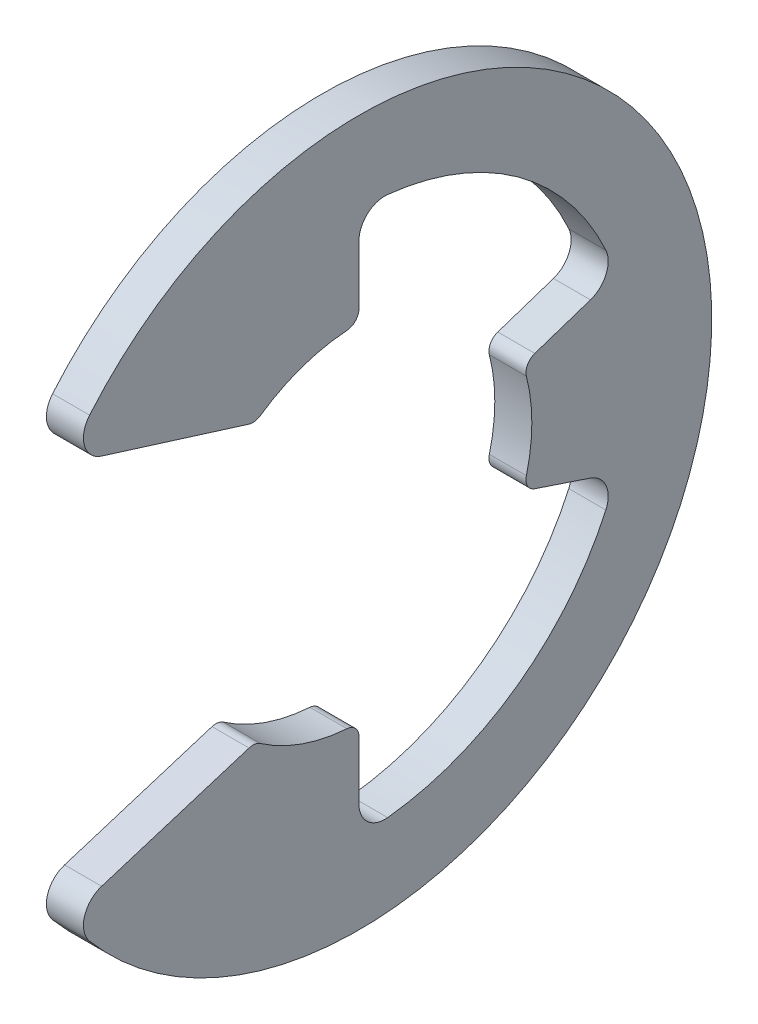
ISO-10303-21;
HEADER;
FILE_DESCRIPTION(('STEP AP214'),'2;1');
FILE_NAME('part.step','',(''),(''),'','','');
FILE_SCHEMA(('AUTOMOTIVE_DESIGN { 1 0 10303 214 1 1 1 1 }'));
ENDSEC;
DATA;
#1=APPLICATION_CONTEXT('core data for automotive mechanical design processes');
#2=APPLICATION_PROTOCOL_DEFINITION('international standard','automotive_design',2000,#1);
#3=PRODUCT_CONTEXT('',#1,'mechanical');
#4=PRODUCT('Part','Part','',(#3));
#5=PRODUCT_RELATED_PRODUCT_CATEGORY('part','',(#4));
#6=PRODUCT_DEFINITION_FORMATION('','',#4);
#7=PRODUCT_DEFINITION_CONTEXT('part definition',#1,'design');
#8=PRODUCT_DEFINITION('design','',#6,#7);
#9=PRODUCT_DEFINITION_SHAPE('','',#8);
#10=(LENGTH_UNIT() NAMED_UNIT(*) SI_UNIT(.MILLI.,.METRE.));
#11=(NAMED_UNIT(*) PLANE_ANGLE_UNIT() SI_UNIT($,.RADIAN.));
#12=(NAMED_UNIT(*) SI_UNIT($,.STERADIAN.) SOLID_ANGLE_UNIT());
#13=UNCERTAINTY_MEASURE_WITH_UNIT(LENGTH_MEASURE(1.E-05),#10,'distance_accuracy_value','');
#14=(GEOMETRIC_REPRESENTATION_CONTEXT(3) GLOBAL_UNCERTAINTY_ASSIGNED_CONTEXT((#13)) GLOBAL_UNIT_ASSIGNED_CONTEXT((#10,
#11,#12)) REPRESENTATION_CONTEXT('',''));
#15=CARTESIAN_POINT('',(0.,0.,0.));
#16=DIRECTION('',(0.,0.,1.));
#17=DIRECTION('',(1.,0.,0.));
#18=AXIS2_PLACEMENT_3D('',#15,#16,#17);
#19=CARTESIAN_POINT('',(0.533399999999999,0.,0.));
#20=DIRECTION('',(-1.,0.,0.));
#21=DIRECTION('',(0.,0.,1.));
#22=AXIS2_PLACEMENT_3D('',#19,#20,#21);
#23=CYLINDRICAL_SURFACE('',#22,4.9784);
#24=CARTESIAN_POINT('',(0.533399999999999,0.,0.));
#25=DIRECTION('',(-1.,0.,0.));
#26=DIRECTION('',(0.,0.,-1.));
#27=AXIS2_PLACEMENT_3D('',#24,#25,#26);
#28=CIRCLE('',#27,4.9784);
#29=CARTESIAN_POINT('',(0.533399999999999,1.24096577634739,-4.82125196416185));
#30=VERTEX_POINT('',#29);
#31=CARTESIAN_POINT('',(0.533399999999999,-1.24096577634739,-4.82125196416185));
#32=VERTEX_POINT('',#31);
#33=EDGE_CURVE('E314',#30,#32,#28,.T.);
#34=ORIENTED_EDGE('',*,*,#33,.F.);
#35=DIRECTION('',(-1.,0.,0.));
#36=VECTOR('',#35,1.);
#37=CARTESIAN_POINT('',(0.533399999999999,1.24096577634739,-4.82125196416185));
#38=LINE('',#37,#36);
#39=CARTESIAN_POINT('',(-0.533400000000001,1.24096577634739,-4.82125196416185));
#40=VERTEX_POINT('',#39);
#41=EDGE_CURVE('E479',#30,#40,#38,.T.);
#42=ORIENTED_EDGE('',*,*,#41,.T.);
#43=CARTESIAN_POINT('',(-0.533400000000001,0.,0.));
#44=DIRECTION('',(-1.,0.,0.));
#45=DIRECTION('',(0.,0.,-1.));
#46=AXIS2_PLACEMENT_3D('',#43,#44,#45);
#47=CIRCLE('',#46,4.9784);
#48=CARTESIAN_POINT('',(-0.533400000000001,-1.24096577634739,-4.82125196416185));
#49=VERTEX_POINT('',#48);
#50=EDGE_CURVE('E544',#40,#49,#47,.T.);
#51=ORIENTED_EDGE('',*,*,#50,.T.);
#52=DIRECTION('',(-1.,0.,0.));
#53=VECTOR('',#52,1.);
#54=CARTESIAN_POINT('',(0.533399999999999,-1.24096577634739,-4.82125196416185));
#55=LINE('',#54,#53);
#56=EDGE_CURVE('E76',#49,#32,#55,.F.);
#57=ORIENTED_EDGE('',*,*,#56,.T.);
#58=EDGE_LOOP('',(#34,#42,#51,#57));
#59=FACE_BOUND('',#58,.T.);
#60=ADVANCED_FACE('F47',(#59),#23,.F.);
#61=CARTESIAN_POINT('',(0.533399999999999,-1.57430831033823,-4.72292493101468));
#62=DIRECTION('',(0.,0.948683298050514,-0.316227766016838));
#63=DIRECTION('',(0.,0.316227766016838,0.948683298050514));
#64=AXIS2_PLACEMENT_3D('',#61,#62,#63);
#65=PLANE('',#64);
#66=DIRECTION('',(0.,-0.316227766016838,-0.948683298050514));
#67=VECTOR('',#66,1.);
#68=CARTESIAN_POINT('',(0.533399999999999,-1.57430831033823,-4.72292493101468));
#69=LINE('',#68,#67);
#70=CARTESIAN_POINT('',(0.533399999999999,-1.68825757939954,-5.06477273819863));
#71=VERTEX_POINT('',#70);
#72=CARTESIAN_POINT('',(0.533399999999999,-2.22214523559516,-6.66643570678547));
#73=VERTEX_POINT('',#72);
#74=EDGE_CURVE('E317',#71,#73,#69,.T.);
#75=ORIENTED_EDGE('',*,*,#74,.F.);
#76=DIRECTION('',(-1.,0.,0.));
#77=VECTOR('',#76,1.);
#78=CARTESIAN_POINT('',(0.533399999999999,-1.68825757939954,-5.06477273819863));
#79=LINE('',#78,#77);
#80=CARTESIAN_POINT('',(-0.533400000000001,-1.68825757939954,-5.06477273819863));
#81=VERTEX_POINT('',#80);
#82=EDGE_CURVE('E486',#71,#81,#79,.T.);
#83=ORIENTED_EDGE('',*,*,#82,.T.);
#84=DIRECTION('',(0.,-0.316227766016838,-0.948683298050514));
#85=VECTOR('',#84,1.);
#86=CARTESIAN_POINT('',(-0.533400000000001,-1.57430831033823,-4.72292493101468));
#87=LINE('',#86,#85);
#88=CARTESIAN_POINT('',(-0.533400000000001,-2.22214523559516,-6.66643570678547));
#89=VERTEX_POINT('',#88);
#90=EDGE_CURVE('E547',#81,#89,#87,.T.);
#91=ORIENTED_EDGE('',*,*,#90,.T.);
#92=DIRECTION('',(1.,0.,0.));
#93=VECTOR('',#92,1.);
#94=CARTESIAN_POINT('',(0.533399999999999,-2.22214523559516,-6.66643570678547));
#95=LINE('',#94,#93);
#96=EDGE_CURVE('E383',#89,#73,#95,.T.);
#97=ORIENTED_EDGE('',*,*,#96,.T.);
#98=EDGE_LOOP('',(#75,#83,#91,#97));
#99=FACE_BOUND('',#98,.T.);
#100=ADVANCED_FACE('F587',(#99),#65,.F.);
#101=CARTESIAN_POINT('',(0.533399999999999,0.,0.));
#102=DIRECTION('',(-1.,0.,0.));
#103=DIRECTION('',(0.,0.,1.));
#104=AXIS2_PLACEMENT_3D('',#101,#102,#103);
#105=CYLINDRICAL_SURFACE('',#104,7.81336774193549);
#106=CARTESIAN_POINT('',(-0.533400000000001,0.,0.));
#107=DIRECTION('',(-1.,0.,0.));
#108=DIRECTION('',(0.,0.,-1.));
#109=AXIS2_PLACEMENT_3D('',#106,#107,#108);
#110=CIRCLE('',#109,7.81336774193549);
#111=CARTESIAN_POINT('',(-0.533400000000001,-3.24027187208205,-7.1098068655704));
#112=VERTEX_POINT('',#111);
#113=CARTESIAN_POINT('',(-0.533400000000001,-7.76961896112721,-0.825673464276603));
#114=VERTEX_POINT('',#113);
#115=EDGE_CURVE('E550',#112,#114,#110,.T.);
#116=ORIENTED_EDGE('',*,*,#115,.T.);
#117=DIRECTION('',(-1.,0.,0.));
#118=VECTOR('',#117,1.);
#119=CARTESIAN_POINT('',(0.533399999999999,-7.76961896112721,-0.825673464276603));
#120=LINE('',#119,#118);
#121=CARTESIAN_POINT('',(0.533399999999999,-7.76961896112721,-0.825673464276603));
#122=VERTEX_POINT('',#121);
#123=EDGE_CURVE('E380',#114,#122,#120,.F.);
#124=ORIENTED_EDGE('',*,*,#123,.T.);
#125=CARTESIAN_POINT('',(0.533399999999999,0.,0.));
#126=DIRECTION('',(-1.,0.,0.));
#127=DIRECTION('',(0.,0.,-1.));
#128=AXIS2_PLACEMENT_3D('',#125,#126,#127);
#129=CIRCLE('',#128,7.81336774193549);
#130=CARTESIAN_POINT('',(0.533399999999999,-3.24027187208205,-7.1098068655704));
#131=VERTEX_POINT('',#130);
#132=EDGE_CURVE('E320',#131,#122,#129,.T.);
#133=ORIENTED_EDGE('',*,*,#132,.F.);
#134=DIRECTION('',(-1.,0.,0.));
#135=VECTOR('',#134,1.);
#136=CARTESIAN_POINT('',(0.533399999999999,-3.24027187208205,-7.1098068655704));
#137=LINE('',#136,#135);
#138=EDGE_CURVE('E376',#131,#112,#137,.T.);
#139=ORIENTED_EDGE('',*,*,#138,.T.);
#140=EDGE_LOOP('',(#116,#124,#133,#139));
#141=FACE_BOUND('',#140,.T.);
#142=ADVANCED_FACE('F593',(#141),#105,.F.);
#143=CARTESIAN_POINT('',(0.533399999999999,-7.81336774193549,0.));
#144=DIRECTION('',(0.,0.,1.));
#145=DIRECTION('',(0.,-1.,0.));
#146=AXIS2_PLACEMENT_3D('',#143,#144,#145);
#147=PLANE('',#146);
#148=DIRECTION('',(0.,1.,0.));
#149=VECTOR('',#148,1.);
#150=CARTESIAN_POINT('',(-0.533400000000001,-7.81336774193549,0.));
#151=LINE('',#150,#149);
#152=CARTESIAN_POINT('',(-0.533400000000001,-7.02704023617216,0.));
#153=VERTEX_POINT('',#152);
#154=CARTESIAN_POINT('',(-0.533400000000001,-5.33873922794512,0.));
#155=VERTEX_POINT('',#154);
#156=EDGE_CURVE('E556',#153,#155,#151,.T.);
#157=ORIENTED_EDGE('',*,*,#156,.T.);
#158=DIRECTION('',(-1.,0.,0.));
#159=VECTOR('',#158,1.);
#160=CARTESIAN_POINT('',(0.533399999999999,-5.33873922794512,0.));
#161=LINE('',#160,#159);
#162=CARTESIAN_POINT('',(0.533399999999999,-5.33873922794512,0.));
#163=VERTEX_POINT('',#162);
#164=EDGE_CURVE('E453',#155,#163,#161,.F.);
#165=ORIENTED_EDGE('',*,*,#164,.T.);
#166=DIRECTION('',(0.,1.,0.));
#167=VECTOR('',#166,1.);
#168=CARTESIAN_POINT('',(0.533399999999999,-7.81336774193549,0.));
#169=LINE('',#168,#167);
#170=CARTESIAN_POINT('',(0.533399999999999,-7.02704023617216,0.));
#171=VERTEX_POINT('',#170);
#172=EDGE_CURVE('E324',#171,#163,#169,.T.);
#173=ORIENTED_EDGE('',*,*,#172,.F.);
#174=DIRECTION('',(1.,0.,0.));
#175=VECTOR('',#174,1.);
#176=CARTESIAN_POINT('',(-0.533400000000001,-7.02704023617216,0.));
#177=LINE('',#176,#175);
#178=EDGE_CURVE('E372',#171,#153,#177,.F.);
#179=ORIENTED_EDGE('',*,*,#178,.T.);
#180=EDGE_LOOP('',(#157,#165,#173,#179));
#181=FACE_BOUND('',#180,.T.);
#182=ADVANCED_FACE('F599',(#181),#147,.F.);
#183=CARTESIAN_POINT('',(0.533399999999999,0.,0.));
#184=DIRECTION('',(-1.,0.,0.));
#185=DIRECTION('',(0.,0.,1.));
#186=AXIS2_PLACEMENT_3D('',#183,#184,#185);
#187=CYLINDRICAL_SURFACE('',#186,4.9784);
#188=CARTESIAN_POINT('',(0.533399999999999,0.,0.));
#189=DIRECTION('',(-1.,0.,0.));
#190=DIRECTION('',(0.,0.,-1.));
#191=AXIS2_PLACEMENT_3D('',#188,#189,#190);
#192=CIRCLE('',#191,4.9784);
#193=CARTESIAN_POINT('',(0.533399999999999,-4.96626904925127,0.347330232558139));
#194=VERTEX_POINT('',#193);
#195=CARTESIAN_POINT('',(0.533399999999999,-4.08820435735341,2.8409596428877));
#196=VERTEX_POINT('',#195);
#197=EDGE_CURVE('E328',#194,#196,#192,.T.);
#198=ORIENTED_EDGE('',*,*,#197,.F.);
#199=DIRECTION('',(-1.,0.,0.));
#200=VECTOR('',#199,1.);
#201=CARTESIAN_POINT('',(0.533399999999999,-4.96626904925127,0.347330232558139));
#202=LINE('',#201,#200);
#203=CARTESIAN_POINT('',(-0.533400000000001,-4.96626904925127,0.347330232558139));
#204=VERTEX_POINT('',#203);
#205=EDGE_CURVE('E431',#194,#204,#202,.T.);
#206=ORIENTED_EDGE('',*,*,#205,.T.);
#207=CARTESIAN_POINT('',(-0.533400000000001,0.,0.));
#208=DIRECTION('',(-1.,0.,0.));
#209=DIRECTION('',(0.,0.,-1.));
#210=AXIS2_PLACEMENT_3D('',#207,#208,#209);
#211=CIRCLE('',#210,4.9784);
#212=CARTESIAN_POINT('',(-0.533400000000001,-4.08820435735341,2.8409596428877));
#213=VERTEX_POINT('',#212);
#214=EDGE_CURVE('E297',#204,#213,#211,.T.);
#215=ORIENTED_EDGE('',*,*,#214,.T.);
#216=DIRECTION('',(-1.,0.,0.));
#217=VECTOR('',#216,1.);
#218=CARTESIAN_POINT('',(0.533399999999999,-4.08820435735341,2.8409596428877));
#219=LINE('',#218,#217);
#220=EDGE_CURVE('E428',#213,#196,#219,.F.);
#221=ORIENTED_EDGE('',*,*,#220,.T.);
#222=EDGE_LOOP('',(#198,#206,#215,#221));
#223=FACE_BOUND('',#222,.T.);
#224=ADVANCED_FACE('F564',(#223),#187,.F.);
#225=CARTESIAN_POINT('',(0.533399999999999,-3.98272,2.98704));
#226=DIRECTION('',(0.,-0.954513538836348,-0.29816757734219));
#227=DIRECTION('',(0.,0.29816757734219,-0.954513538836348));
#228=AXIS2_PLACEMENT_3D('',#225,#226,#227);
#229=PLANE('',#228);
#230=DIRECTION('',(0.,-0.29816757734219,0.954513538836348));
#231=VECTOR('',#230,1.);
#232=CARTESIAN_POINT('',(0.533399999999999,-3.98272,2.98704));
#233=LINE('',#232,#231);
#234=CARTESIAN_POINT('',(0.533399999999999,-4.0384234190242,3.1653614261323));
#235=VERTEX_POINT('',#234);
#236=CARTESIAN_POINT('',(0.533399999999999,-5.3646852433573,7.41107747162606));
#237=VERTEX_POINT('',#236);
#238=EDGE_CURVE('E332',#235,#237,#233,.T.);
#239=ORIENTED_EDGE('',*,*,#238,.F.);
#240=DIRECTION('',(-1.,0.,0.));
#241=VECTOR('',#240,1.);
#242=CARTESIAN_POINT('',(0.533399999999999,-4.0384234190242,3.1653614261323));
#243=LINE('',#242,#241);
#244=CARTESIAN_POINT('',(-0.533400000000001,-4.0384234190242,3.1653614261323));
#245=VERTEX_POINT('',#244);
#246=EDGE_CURVE('E473',#235,#245,#243,.T.);
#247=ORIENTED_EDGE('',*,*,#246,.T.);
#248=DIRECTION('',(0.,-0.29816757734219,0.954513538836348));
#249=VECTOR('',#248,1.);
#250=CARTESIAN_POINT('',(-0.533400000000001,-3.98272,2.98704));
#251=LINE('',#250,#249);
#252=CARTESIAN_POINT('',(-0.533400000000001,-5.3646852433573,7.41107747162606));
#253=VERTEX_POINT('',#252);
#254=EDGE_CURVE('E289',#245,#253,#251,.T.);
#255=ORIENTED_EDGE('',*,*,#254,.T.);
#256=DIRECTION('',(-1.,0.,0.));
#257=VECTOR('',#256,1.);
#258=CARTESIAN_POINT('',(0.533399999999999,-5.3646852433573,7.41107747162606));
#259=LINE('',#258,#257);
#260=EDGE_CURVE('E266',#253,#237,#259,.F.);
#261=ORIENTED_EDGE('',*,*,#260,.T.);
#262=EDGE_LOOP('',(#239,#247,#255,#261));
#263=FACE_BOUND('',#262,.T.);
#264=ADVANCED_FACE('F572',(#263),#229,.F.);
#265=CARTESIAN_POINT('',(0.533399999999999,0.,0.));
#266=DIRECTION('',(-1.,0.,0.));
#267=DIRECTION('',(0.,0.,1.));
#268=AXIS2_PLACEMENT_3D('',#265,#266,#267);
#269=CYLINDRICAL_SURFACE('',#268,10.16);
#270=CARTESIAN_POINT('',(0.533399999999999,0.,0.));
#271=DIRECTION('',(1.,0.,0.));
#272=DIRECTION('',(0.,0.,-1.));
#273=AXIS2_PLACEMENT_3D('',#270,#271,#272);
#274=CIRCLE('',#273,10.16);
#275=CARTESIAN_POINT('',(0.533399999999999,-6.55960903790472,7.75868089753913));
#276=VERTEX_POINT('',#275);
#277=CARTESIAN_POINT('',(0.533399999999999,6.55960903790473,7.75868089753913));
#278=VERTEX_POINT('',#277);
#279=EDGE_CURVE('E280',#276,#278,#274,.T.);
#280=ORIENTED_EDGE('',*,*,#279,.F.);
#281=DIRECTION('',(-1.,0.,0.));
#282=VECTOR('',#281,1.);
#283=CARTESIAN_POINT('',(0.533399999999999,-6.55960903790472,7.75868089753913));
#284=LINE('',#283,#282);
#285=CARTESIAN_POINT('',(-0.533400000000001,-6.55960903790472,7.75868089753913));
#286=VERTEX_POINT('',#285);
#287=EDGE_CURVE('E264',#276,#286,#284,.T.);
#288=ORIENTED_EDGE('',*,*,#287,.T.);
#289=CARTESIAN_POINT('',(-0.533400000000001,0.,0.));
#290=DIRECTION('',(1.,0.,0.));
#291=DIRECTION('',(0.,0.,-1.));
#292=AXIS2_PLACEMENT_3D('',#289,#290,#291);
#293=CIRCLE('',#292,10.16);
#294=CARTESIAN_POINT('',(-0.533400000000001,6.55960903790473,7.75868089753913));
#295=VERTEX_POINT('',#294);
#296=EDGE_CURVE('E277',#286,#295,#293,.T.);
#297=ORIENTED_EDGE('',*,*,#296,.T.);
#298=DIRECTION('',(-1.,0.,0.));
#299=VECTOR('',#298,1.);
#300=CARTESIAN_POINT('',(0.533399999999999,6.55960903790473,7.75868089753913));
#301=LINE('',#300,#299);
#302=EDGE_CURVE('E282',#295,#278,#301,.F.);
#303=ORIENTED_EDGE('',*,*,#302,.T.);
#304=EDGE_LOOP('',(#280,#288,#297,#303));
#305=FACE_BOUND('',#304,.T.);
#306=ADVANCED_FACE('F276',(#305),#269,.T.);
#307=CARTESIAN_POINT('',(0.533399999999999,5.68089847288051,8.4233599318101));
#308=DIRECTION('',(0.,0.954513538836348,-0.29816757734219));
#309=DIRECTION('',(0.,0.29816757734219,0.954513538836348));
#310=AXIS2_PLACEMENT_3D('',#307,#308,#309);
#311=PLANE('',#310);
#312=DIRECTION('',(0.,-0.29816757734219,-0.954513538836348));
#313=VECTOR('',#312,1.);
#314=CARTESIAN_POINT('',(-0.533400000000001,5.68089847288051,8.4233599318101));
#315=LINE('',#314,#313);
#316=CARTESIAN_POINT('',(-0.533400000000001,5.3646852433573,7.41107747162606));
#317=VERTEX_POINT('',#316);
#318=CARTESIAN_POINT('',(-0.533400000000001,4.0384234190242,3.1653614261323));
#319=VERTEX_POINT('',#318);
#320=EDGE_CURVE('E288',#317,#319,#315,.T.);
#321=ORIENTED_EDGE('',*,*,#320,.T.);
#322=DIRECTION('',(-1.,0.,0.));
#323=VECTOR('',#322,1.);
#324=CARTESIAN_POINT('',(0.533399999999999,4.0384234190242,3.1653614261323));
#325=LINE('',#324,#323);
#326=CARTESIAN_POINT('',(0.533399999999999,4.0384234190242,3.1653614261323));
#327=VERTEX_POINT('',#326);
#328=EDGE_CURVE('E56',#319,#327,#325,.F.);
#329=ORIENTED_EDGE('',*,*,#328,.T.);
#330=DIRECTION('',(0.,-0.29816757734219,-0.954513538836348));
#331=VECTOR('',#330,1.);
#332=CARTESIAN_POINT('',(0.533399999999999,5.68089847288051,8.4233599318101));
#333=LINE('',#332,#331);
#334=CARTESIAN_POINT('',(0.533399999999999,5.3646852433573,7.41107747162606));
#335=VERTEX_POINT('',#334);
#336=EDGE_CURVE('E337',#335,#327,#333,.T.);
#337=ORIENTED_EDGE('',*,*,#336,.F.);
#338=DIRECTION('',(-1.,0.,0.));
#339=VECTOR('',#338,1.);
#340=CARTESIAN_POINT('',(0.533399999999999,5.3646852433573,7.41107747162606));
#341=LINE('',#340,#339);
#342=EDGE_CURVE('E368',#335,#317,#341,.T.);
#343=ORIENTED_EDGE('',*,*,#342,.T.);
#344=EDGE_LOOP('',(#321,#329,#337,#343));
#345=FACE_BOUND('',#344,.T.);
#346=ADVANCED_FACE('F500',(#345),#311,.F.);
#347=CARTESIAN_POINT('',(0.533399999999999,0.,0.));
#348=DIRECTION('',(-1.,0.,0.));
#349=DIRECTION('',(0.,0.,1.));
#350=AXIS2_PLACEMENT_3D('',#347,#348,#349);
#351=CYLINDRICAL_SURFACE('',#350,4.9784);
#352=CARTESIAN_POINT('',(0.533399999999999,0.,0.));
#353=DIRECTION('',(-1.,0.,0.));
#354=DIRECTION('',(0.,0.,-1.));
#355=AXIS2_PLACEMENT_3D('',#352,#353,#354);
#356=CIRCLE('',#355,4.9784);
#357=CARTESIAN_POINT('',(0.533399999999999,4.08820435735341,2.8409596428877));
#358=VERTEX_POINT('',#357);
#359=CARTESIAN_POINT('',(0.533399999999999,4.96626904925127,0.34733023255814));
#360=VERTEX_POINT('',#359);
#361=EDGE_CURVE('E341',#358,#360,#356,.T.);
#362=ORIENTED_EDGE('',*,*,#361,.F.);
#363=DIRECTION('',(-1.,0.,0.));
#364=VECTOR('',#363,1.);
#365=CARTESIAN_POINT('',(0.533399999999999,4.08820435735341,2.8409596428877));
#366=LINE('',#365,#364);
#367=CARTESIAN_POINT('',(-0.533400000000001,4.08820435735341,2.8409596428877));
#368=VERTEX_POINT('',#367);
#369=EDGE_CURVE('E493',#358,#368,#366,.T.);
#370=ORIENTED_EDGE('',*,*,#369,.T.);
#371=CARTESIAN_POINT('',(-0.533400000000001,0.,0.));
#372=DIRECTION('',(-1.,0.,0.));
#373=DIRECTION('',(0.,0.,-1.));
#374=AXIS2_PLACEMENT_3D('',#371,#372,#373);
#375=CIRCLE('',#374,4.9784);
#376=CARTESIAN_POINT('',(-0.533400000000001,4.96626904925127,0.34733023255814));
#377=VERTEX_POINT('',#376);
#378=EDGE_CURVE('E294',#368,#377,#375,.T.);
#379=ORIENTED_EDGE('',*,*,#378,.T.);
#380=DIRECTION('',(-1.,0.,0.));
#381=VECTOR('',#380,1.);
#382=CARTESIAN_POINT('',(0.533399999999999,4.96626904925127,0.34733023255814));
#383=LINE('',#382,#381);
#384=EDGE_CURVE('E490',#377,#360,#383,.F.);
#385=ORIENTED_EDGE('',*,*,#384,.T.);
#386=EDGE_LOOP('',(#362,#370,#379,#385));
#387=FACE_BOUND('',#386,.T.);
#388=ADVANCED_FACE('F511',(#387),#351,.F.);
#389=CARTESIAN_POINT('',(0.533399999999999,4.9784,0.));
#390=DIRECTION('',(0.,0.,1.));
#391=DIRECTION('',(0.,-1.,0.));
#392=AXIS2_PLACEMENT_3D('',#389,#390,#391);
#393=PLANE('',#392);
#394=DIRECTION('',(0.,1.,0.));
#395=VECTOR('',#394,1.);
#396=CARTESIAN_POINT('',(0.533399999999999,4.9784,0.));
#397=LINE('',#396,#395);
#398=CARTESIAN_POINT('',(0.533399999999999,5.33873922794512,0.));
#399=VERTEX_POINT('',#398);
#400=CARTESIAN_POINT('',(0.533399999999999,7.02704023617216,0.));
#401=VERTEX_POINT('',#400);
#402=EDGE_CURVE('E345',#399,#401,#397,.T.);
#403=ORIENTED_EDGE('',*,*,#402,.F.);
#404=DIRECTION('',(-1.,0.,0.));
#405=VECTOR('',#404,1.);
#406=CARTESIAN_POINT('',(0.533399999999999,5.33873922794512,0.));
#407=LINE('',#406,#405);
#408=CARTESIAN_POINT('',(-0.533400000000001,5.33873922794512,0.));
#409=VERTEX_POINT('',#408);
#410=EDGE_CURVE('E11',#399,#409,#407,.T.);
#411=ORIENTED_EDGE('',*,*,#410,.T.);
#412=DIRECTION('',(0.,1.,0.));
#413=VECTOR('',#412,1.);
#414=CARTESIAN_POINT('',(-0.533400000000001,4.9784,0.));
#415=LINE('',#414,#413);
#416=CARTESIAN_POINT('',(-0.533400000000001,7.02704023617216,0.));
#417=VERTEX_POINT('',#416);
#418=EDGE_CURVE('E304',#409,#417,#415,.T.);
#419=ORIENTED_EDGE('',*,*,#418,.T.);
#420=DIRECTION('',(1.,0.,0.));
#421=VECTOR('',#420,1.);
#422=CARTESIAN_POINT('',(0.533399999999999,7.02704023617216,0.));
#423=LINE('',#422,#421);
#424=EDGE_CURVE('E398',#417,#401,#423,.T.);
#425=ORIENTED_EDGE('',*,*,#424,.T.);
#426=EDGE_LOOP('',(#403,#411,#419,#425));
#427=FACE_BOUND('',#426,.T.);
#428=ADVANCED_FACE('F519',(#427),#393,.F.);
#429=CARTESIAN_POINT('',(0.533399999999999,0.,0.));
#430=DIRECTION('',(-1.,0.,0.));
#431=DIRECTION('',(0.,0.,1.));
#432=AXIS2_PLACEMENT_3D('',#429,#430,#431);
#433=CYLINDRICAL_SURFACE('',#432,7.81336774193549);
#434=CARTESIAN_POINT('',(-0.533400000000001,0.,0.));
#435=DIRECTION('',(-1.,0.,0.));
#436=DIRECTION('',(0.,0.,-1.));
#437=AXIS2_PLACEMENT_3D('',#434,#435,#436);
#438=CIRCLE('',#437,7.81336774193549);
#439=CARTESIAN_POINT('',(-0.533400000000001,7.76961896112721,-0.825673464276603));
#440=VERTEX_POINT('',#439);
#441=CARTESIAN_POINT('',(-0.533400000000001,3.24027187208205,-7.1098068655704));
#442=VERTEX_POINT('',#441);
#443=EDGE_CURVE('E307',#440,#442,#438,.T.);
#444=ORIENTED_EDGE('',*,*,#443,.T.);
#445=DIRECTION('',(-1.,0.,0.));
#446=VECTOR('',#445,1.);
#447=CARTESIAN_POINT('',(0.533399999999999,3.24027187208205,-7.10980686557039));
#448=LINE('',#447,#446);
#449=CARTESIAN_POINT('',(0.533399999999999,3.24027187208205,-7.1098068655704));
#450=VERTEX_POINT('',#449);
#451=EDGE_CURVE('E395',#442,#450,#448,.F.);
#452=ORIENTED_EDGE('',*,*,#451,.T.);
#453=CARTESIAN_POINT('',(0.533399999999999,0.,0.));
#454=DIRECTION('',(-1.,0.,0.));
#455=DIRECTION('',(0.,0.,-1.));
#456=AXIS2_PLACEMENT_3D('',#453,#454,#455);
#457=CIRCLE('',#456,7.81336774193549);
#458=CARTESIAN_POINT('',(0.533399999999999,7.76961896112721,-0.825673464276603));
#459=VERTEX_POINT('',#458);
#460=EDGE_CURVE('E348',#459,#450,#457,.T.);
#461=ORIENTED_EDGE('',*,*,#460,.F.);
#462=DIRECTION('',(-1.,0.,0.));
#463=VECTOR('',#462,1.);
#464=CARTESIAN_POINT('',(0.533399999999999,7.76961896112721,-0.825673464276603));
#465=LINE('',#464,#463);
#466=EDGE_CURVE('E391',#459,#440,#465,.T.);
#467=ORIENTED_EDGE('',*,*,#466,.T.);
#468=EDGE_LOOP('',(#444,#452,#461,#467));
#469=FACE_BOUND('',#468,.T.);
#470=ADVANCED_FACE('F527',(#469),#433,.F.);
#471=CARTESIAN_POINT('',(0.533399999999999,2.47080382610029,-7.41241147830085));
#472=DIRECTION('',(0.,-0.948683298050514,-0.316227766016838));
#473=DIRECTION('',(0.,0.316227766016838,-0.948683298050514));
#474=AXIS2_PLACEMENT_3D('',#471,#472,#473);
#475=PLANE('',#474);
#476=DIRECTION('',(0.,-0.316227766016838,0.948683298050514));
#477=VECTOR('',#476,1.);
#478=CARTESIAN_POINT('',(-0.533400000000001,2.47080382610029,-7.41241147830085));
#479=LINE('',#478,#477);
#480=CARTESIAN_POINT('',(-0.533400000000001,2.22214523559516,-6.66643570678547));
#481=VERTEX_POINT('',#480);
#482=CARTESIAN_POINT('',(-0.533400000000001,1.68825757939954,-5.06477273819863));
#483=VERTEX_POINT('',#482);
#484=EDGE_CURVE('E310',#481,#483,#479,.T.);
#485=ORIENTED_EDGE('',*,*,#484,.T.);
#486=DIRECTION('',(-1.,0.,0.));
#487=VECTOR('',#486,1.);
#488=CARTESIAN_POINT('',(0.533399999999999,1.68825757939954,-5.06477273819863));
#489=LINE('',#488,#487);
#490=CARTESIAN_POINT('',(0.533399999999999,1.68825757939954,-5.06477273819863));
#491=VERTEX_POINT('',#490);
#492=EDGE_CURVE('E483',#483,#491,#489,.F.);
#493=ORIENTED_EDGE('',*,*,#492,.T.);
#494=DIRECTION('',(0.,-0.316227766016838,0.948683298050514));
#495=VECTOR('',#494,1.);
#496=CARTESIAN_POINT('',(0.533399999999999,2.47080382610029,-7.41241147830085));
#497=LINE('',#496,#495);
#498=CARTESIAN_POINT('',(0.533399999999999,2.22214523559516,-6.66643570678547));
#499=VERTEX_POINT('',#498);
#500=EDGE_CURVE('E352',#499,#491,#497,.T.);
#501=ORIENTED_EDGE('',*,*,#500,.F.);
#502=DIRECTION('',(1.,0.,0.));
#503=VECTOR('',#502,1.);
#504=CARTESIAN_POINT('',(-0.533400000000001,2.22214523559516,-6.66643570678547));
#505=LINE('',#504,#503);
#506=EDGE_CURVE('E387',#499,#481,#505,.F.);
#507=ORIENTED_EDGE('',*,*,#506,.T.);
#508=EDGE_LOOP('',(#485,#493,#501,#507));
#509=FACE_BOUND('',#508,.T.);
#510=ADVANCED_FACE('F538',(#509),#475,.F.);
#511=CARTESIAN_POINT('',(0.533399999999999,0.,0.));
#512=DIRECTION('',(1.,0.,0.));
#513=DIRECTION('',(0.,0.,-1.));
#514=AXIS2_PLACEMENT_3D('',#511,#512,#513);
#515=PLANE('',#514);
#516=ORIENTED_EDGE('',*,*,#172,.T.);
#517=CARTESIAN_POINT('',(0.533399999999999,-5.33873922794512,0.37338));
#518=DIRECTION('',(1.,0.,0.));
#519=DIRECTION('',(0.,0.,-1.));
#520=AXIS2_PLACEMENT_3D('',#517,#518,#519);
#521=CIRCLE('',#520,0.37338);
#522=EDGE_CURVE('E470',#163,#194,#521,.T.);
#523=ORIENTED_EDGE('',*,*,#522,.T.);
#524=ORIENTED_EDGE('',*,*,#197,.T.);
#525=CARTESIAN_POINT('',(0.533399999999999,-4.39481968415491,3.05403161610428));
#526=DIRECTION('',(1.,0.,0.));
#527=DIRECTION('',(0.,0.,-1.));
#528=AXIS2_PLACEMENT_3D('',#525,#526,#527);
#529=CIRCLE('',#528,0.37338);
#530=EDGE_CURVE('E467',#196,#235,#529,.T.);
#531=ORIENTED_EDGE('',*,*,#530,.T.);
#532=ORIENTED_EDGE('',*,*,#238,.T.);
#533=CARTESIAN_POINT('',(0.533399999999999,-6.07747777361873,7.18841785157));
#534=DIRECTION('',(1.,0.,0.));
#535=DIRECTION('',(0.,0.,-1.));
#536=AXIS2_PLACEMENT_3D('',#533,#534,#535);
#537=CIRCLE('',#536,0.74676);
#538=EDGE_CURVE('E365',#237,#276,#537,.T.);
#539=ORIENTED_EDGE('',*,*,#538,.T.);
#540=ORIENTED_EDGE('',*,*,#279,.T.);
#541=CARTESIAN_POINT('',(0.533399999999999,6.07747777361873,7.18841785157));
#542=DIRECTION('',(1.,0.,0.));
#543=DIRECTION('',(0.,0.,-1.));
#544=AXIS2_PLACEMENT_3D('',#541,#542,#543);
#545=CIRCLE('',#544,0.74676);
#546=EDGE_CURVE('E362',#278,#335,#545,.T.);
#547=ORIENTED_EDGE('',*,*,#546,.T.);
#548=ORIENTED_EDGE('',*,*,#336,.T.);
#549=CARTESIAN_POINT('',(0.533399999999999,4.39481968415491,3.05403161610428));
#550=DIRECTION('',(1.,0.,0.));
#551=DIRECTION('',(0.,0.,-1.));
#552=AXIS2_PLACEMENT_3D('',#549,#550,#551);
#553=CIRCLE('',#552,0.37338);
#554=EDGE_CURVE('E459',#327,#358,#553,.T.);
#555=ORIENTED_EDGE('',*,*,#554,.T.);
#556=ORIENTED_EDGE('',*,*,#361,.T.);
#557=CARTESIAN_POINT('',(0.533399999999999,5.33873922794512,0.373380000000001));
#558=DIRECTION('',(1.,0.,0.));
#559=DIRECTION('',(0.,0.,-1.));
#560=AXIS2_PLACEMENT_3D('',#557,#558,#559);
#561=CIRCLE('',#560,0.37338);
#562=EDGE_CURVE('E456',#360,#399,#561,.T.);
#563=ORIENTED_EDGE('',*,*,#562,.T.);
#564=ORIENTED_EDGE('',*,*,#402,.T.);
#565=CARTESIAN_POINT('',(0.533399999999999,7.02704023617216,-0.746759999999999));
#566=DIRECTION('',(1.,0.,0.));
#567=DIRECTION('',(0.,0.,-1.));
#568=AXIS2_PLACEMENT_3D('',#565,#566,#567);
#569=CIRCLE('',#568,0.74676);
#570=EDGE_CURVE('E425',#401,#459,#569,.F.);
#571=ORIENTED_EDGE('',*,*,#570,.T.);
#572=ORIENTED_EDGE('',*,*,#460,.T.);
#573=CARTESIAN_POINT('',(0.533399999999999,2.93058397524736,-6.43028946023474));
#574=DIRECTION('',(1.,0.,0.));
#575=DIRECTION('',(0.,0.,-1.));
#576=AXIS2_PLACEMENT_3D('',#573,#574,#575);
#577=CIRCLE('',#576,0.74676);
#578=EDGE_CURVE('E418',#450,#499,#577,.F.);
#579=ORIENTED_EDGE('',*,*,#578,.T.);
#580=ORIENTED_EDGE('',*,*,#500,.T.);
#581=CARTESIAN_POINT('',(0.533399999999999,1.33403820957344,-5.18284586147399));
#582=DIRECTION('',(1.,0.,0.));
#583=DIRECTION('',(0.,0.,-1.));
#584=AXIS2_PLACEMENT_3D('',#581,#582,#583);
#585=CIRCLE('',#584,0.37338);
#586=EDGE_CURVE('E464',#491,#30,#585,.T.);
#587=ORIENTED_EDGE('',*,*,#586,.T.);
#588=ORIENTED_EDGE('',*,*,#33,.T.);
#589=CARTESIAN_POINT('',(0.533399999999999,-1.33403820957344,-5.18284586147399));
#590=DIRECTION('',(1.,0.,0.));
#591=DIRECTION('',(0.,0.,-1.));
#592=AXIS2_PLACEMENT_3D('',#589,#590,#591);
#593=CIRCLE('',#592,0.37338);
#594=EDGE_CURVE('E66',#32,#71,#593,.T.);
#595=ORIENTED_EDGE('',*,*,#594,.T.);
#596=ORIENTED_EDGE('',*,*,#74,.T.);
#597=CARTESIAN_POINT('',(0.533399999999999,-2.93058397524736,-6.43028946023474));
#598=DIRECTION('',(1.,0.,0.));
#599=DIRECTION('',(0.,0.,-1.));
#600=AXIS2_PLACEMENT_3D('',#597,#598,#599);
#601=CIRCLE('',#600,0.74676);
#602=EDGE_CURVE('E412',#73,#131,#601,.F.);
#603=ORIENTED_EDGE('',*,*,#602,.T.);
#604=ORIENTED_EDGE('',*,*,#132,.T.);
#605=CARTESIAN_POINT('',(0.533399999999999,-7.02704023617216,-0.746759999999999));
#606=DIRECTION('',(1.,0.,0.));
#607=DIRECTION('',(0.,0.,-1.));
#608=AXIS2_PLACEMENT_3D('',#605,#606,#607);
#609=CIRCLE('',#608,0.74676);
#610=EDGE_CURVE('E405',#122,#171,#609,.F.);
#611=ORIENTED_EDGE('',*,*,#610,.T.);
#612=EDGE_LOOP('',(#516,#523,#524,#531,#532,#539,#540,#547,#548,#555,#556,#563,#564,#571,#572,
#579,#580,#587,#588,#595,#596,#603,#604,#611));
#613=FACE_BOUND('',#612,.T.);
#614=ADVANCED_FACE('F504',(#613),#515,.T.);
#615=CARTESIAN_POINT('',(-0.533400000000001,0.,0.));
#616=DIRECTION('',(1.,0.,0.));
#617=DIRECTION('',(0.,0.,-1.));
#618=AXIS2_PLACEMENT_3D('',#615,#616,#617);
#619=PLANE('',#618);
#620=ORIENTED_EDGE('',*,*,#214,.F.);
#621=CARTESIAN_POINT('',(-0.533400000000001,-5.33873922794512,0.37338));
#622=DIRECTION('',(1.,0.,0.));
#623=DIRECTION('',(0.,0.,-1.));
#624=AXIS2_PLACEMENT_3D('',#621,#622,#623);
#625=CIRCLE('',#624,0.37338);
#626=EDGE_CURVE('E450',#204,#155,#625,.F.);
#627=ORIENTED_EDGE('',*,*,#626,.T.);
#628=ORIENTED_EDGE('',*,*,#156,.F.);
#629=CARTESIAN_POINT('',(-0.533400000000001,-7.02704023617216,-0.746759999999999));
#630=DIRECTION('',(1.,0.,0.));
#631=DIRECTION('',(0.,0.,-1.));
#632=AXIS2_PLACEMENT_3D('',#629,#630,#631);
#633=CIRCLE('',#632,0.74676);
#634=EDGE_CURVE('E402',#153,#114,#633,.T.);
#635=ORIENTED_EDGE('',*,*,#634,.T.);
#636=ORIENTED_EDGE('',*,*,#115,.F.);
#637=CARTESIAN_POINT('',(-0.533400000000001,-2.93058397524736,-6.43028946023474));
#638=DIRECTION('',(1.,0.,0.));
#639=DIRECTION('',(0.,0.,-1.));
#640=AXIS2_PLACEMENT_3D('',#637,#638,#639);
#641=CIRCLE('',#640,0.74676);
#642=EDGE_CURVE('E408',#112,#89,#641,.T.);
#643=ORIENTED_EDGE('',*,*,#642,.T.);
#644=ORIENTED_EDGE('',*,*,#90,.F.);
#645=CARTESIAN_POINT('',(-0.533400000000001,-1.33403820957344,-5.18284586147399));
#646=DIRECTION('',(1.,0.,0.));
#647=DIRECTION('',(0.,0.,-1.));
#648=AXIS2_PLACEMENT_3D('',#645,#646,#647);
#649=CIRCLE('',#648,0.37338);
#650=EDGE_CURVE('E441',#81,#49,#649,.F.);
#651=ORIENTED_EDGE('',*,*,#650,.T.);
#652=ORIENTED_EDGE('',*,*,#50,.F.);
#653=CARTESIAN_POINT('',(-0.533400000000001,1.33403820957344,-5.18284586147399));
#654=DIRECTION('',(1.,0.,0.));
#655=DIRECTION('',(0.,0.,-1.));
#656=AXIS2_PLACEMENT_3D('',#653,#654,#655);
#657=CIRCLE('',#656,0.37338);
#658=EDGE_CURVE('E444',#40,#483,#657,.F.);
#659=ORIENTED_EDGE('',*,*,#658,.T.);
#660=ORIENTED_EDGE('',*,*,#484,.F.);
#661=CARTESIAN_POINT('',(-0.533400000000001,2.93058397524736,-6.43028946023474));
#662=DIRECTION('',(1.,0.,0.));
#663=DIRECTION('',(0.,0.,-1.));
#664=AXIS2_PLACEMENT_3D('',#661,#662,#663);
#665=CIRCLE('',#664,0.74676);
#666=EDGE_CURVE('E415',#481,#442,#665,.T.);
#667=ORIENTED_EDGE('',*,*,#666,.T.);
#668=ORIENTED_EDGE('',*,*,#443,.F.);
#669=CARTESIAN_POINT('',(-0.533400000000001,7.02704023617216,-0.746759999999999));
#670=DIRECTION('',(1.,0.,0.));
#671=DIRECTION('',(0.,0.,-1.));
#672=AXIS2_PLACEMENT_3D('',#669,#670,#671);
#673=CIRCLE('',#672,0.74676);
#674=EDGE_CURVE('E421',#440,#417,#673,.T.);
#675=ORIENTED_EDGE('',*,*,#674,.T.);
#676=ORIENTED_EDGE('',*,*,#418,.F.);
#677=CARTESIAN_POINT('',(-0.533400000000001,5.33873922794512,0.373380000000001));
#678=DIRECTION('',(1.,0.,0.));
#679=DIRECTION('',(0.,0.,-1.));
#680=AXIS2_PLACEMENT_3D('',#677,#678,#679);
#681=CIRCLE('',#680,0.37338);
#682=EDGE_CURVE('E435',#409,#377,#681,.F.);
#683=ORIENTED_EDGE('',*,*,#682,.T.);
#684=ORIENTED_EDGE('',*,*,#378,.F.);
#685=CARTESIAN_POINT('',(-0.533400000000001,4.39481968415491,3.05403161610428));
#686=DIRECTION('',(1.,0.,0.));
#687=DIRECTION('',(0.,0.,-1.));
#688=AXIS2_PLACEMENT_3D('',#685,#686,#687);
#689=CIRCLE('',#688,0.37338);
#690=EDGE_CURVE('E438',#368,#319,#689,.F.);
#691=ORIENTED_EDGE('',*,*,#690,.T.);
#692=ORIENTED_EDGE('',*,*,#320,.F.);
#693=CARTESIAN_POINT('',(-0.533400000000001,6.07747777361873,7.18841785157));
#694=DIRECTION('',(1.,0.,0.));
#695=DIRECTION('',(0.,0.,-1.));
#696=AXIS2_PLACEMENT_3D('',#693,#694,#695);
#697=CIRCLE('',#696,0.74676);
#698=EDGE_CURVE('E271',#317,#295,#697,.F.);
#699=ORIENTED_EDGE('',*,*,#698,.T.);
#700=ORIENTED_EDGE('',*,*,#296,.F.);
#701=CARTESIAN_POINT('',(-0.533400000000001,-6.07747777361873,7.18841785157));
#702=DIRECTION('',(1.,0.,0.));
#703=DIRECTION('',(0.,0.,-1.));
#704=AXIS2_PLACEMENT_3D('',#701,#702,#703);
#705=CIRCLE('',#704,0.74676);
#706=EDGE_CURVE('E260',#286,#253,#705,.F.);
#707=ORIENTED_EDGE('',*,*,#706,.T.);
#708=ORIENTED_EDGE('',*,*,#254,.F.);
#709=CARTESIAN_POINT('',(-0.533400000000001,-4.39481968415491,3.05403161610428));
#710=DIRECTION('',(1.,0.,0.));
#711=DIRECTION('',(0.,0.,-1.));
#712=AXIS2_PLACEMENT_3D('',#709,#710,#711);
#713=CIRCLE('',#712,0.37338);
#714=EDGE_CURVE('E447',#245,#213,#713,.F.);
#715=ORIENTED_EDGE('',*,*,#714,.T.);
#716=EDGE_LOOP('',(#620,#627,#628,#635,#636,#643,#644,#651,#652,#659,#660,#667,#668,#675,#676,
#683,#684,#691,#692,#699,#700,#707,#708,#715));
#717=FACE_BOUND('',#716,.T.);
#718=ADVANCED_FACE('F285',(#717),#619,.F.);
#719=CARTESIAN_POINT('',(0.533399999999999,-6.07747777361873,7.18841785157));
#720=DIRECTION('',(-1.,0.,0.));
#721=DIRECTION('',(0.,0.,1.));
#722=AXIS2_PLACEMENT_3D('',#719,#720,#721);
#723=CYLINDRICAL_SURFACE('',#722,0.74676);
#724=ORIENTED_EDGE('',*,*,#538,.F.);
#725=ORIENTED_EDGE('',*,*,#260,.F.);
#726=ORIENTED_EDGE('',*,*,#706,.F.);
#727=ORIENTED_EDGE('',*,*,#287,.F.);
#728=EDGE_LOOP('',(#724,#725,#726,#727));
#729=FACE_BOUND('',#728,.T.);
#730=ADVANCED_FACE('F263',(#729),#723,.T.);
#731=CARTESIAN_POINT('',(0.533399999999999,6.07747777361873,7.18841785157));
#732=DIRECTION('',(-1.,0.,0.));
#733=DIRECTION('',(0.,0.,1.));
#734=AXIS2_PLACEMENT_3D('',#731,#732,#733);
#735=CYLINDRICAL_SURFACE('',#734,0.74676);
#736=ORIENTED_EDGE('',*,*,#546,.F.);
#737=ORIENTED_EDGE('',*,*,#302,.F.);
#738=ORIENTED_EDGE('',*,*,#698,.F.);
#739=ORIENTED_EDGE('',*,*,#342,.F.);
#740=EDGE_LOOP('',(#736,#737,#738,#739));
#741=FACE_BOUND('',#740,.T.);
#742=ADVANCED_FACE('F574',(#741),#735,.T.);
#743=CARTESIAN_POINT('',(0.533399999999999,-7.02704023617216,-0.746759999999999));
#744=DIRECTION('',(-1.,0.,0.));
#745=DIRECTION('',(0.,0.,1.));
#746=AXIS2_PLACEMENT_3D('',#743,#744,#745);
#747=CYLINDRICAL_SURFACE('',#746,0.74676);
#748=ORIENTED_EDGE('',*,*,#610,.F.);
#749=ORIENTED_EDGE('',*,*,#123,.F.);
#750=ORIENTED_EDGE('',*,*,#634,.F.);
#751=ORIENTED_EDGE('',*,*,#178,.F.);
#752=EDGE_LOOP('',(#748,#749,#750,#751));
#753=FACE_BOUND('',#752,.T.);
#754=ADVANCED_FACE('F576',(#753),#747,.F.);
#755=CARTESIAN_POINT('',(0.533399999999999,-2.93058397524736,-6.43028946023474));
#756=DIRECTION('',(-1.,0.,0.));
#757=DIRECTION('',(0.,0.,1.));
#758=AXIS2_PLACEMENT_3D('',#755,#756,#757);
#759=CYLINDRICAL_SURFACE('',#758,0.74676);
#760=ORIENTED_EDGE('',*,*,#602,.F.);
#761=ORIENTED_EDGE('',*,*,#96,.F.);
#762=ORIENTED_EDGE('',*,*,#642,.F.);
#763=ORIENTED_EDGE('',*,*,#138,.F.);
#764=EDGE_LOOP('',(#760,#761,#762,#763));
#765=FACE_BOUND('',#764,.T.);
#766=ADVANCED_FACE('F582',(#765),#759,.F.);
#767=CARTESIAN_POINT('',(0.533399999999999,2.93058397524736,-6.43028946023474));
#768=DIRECTION('',(-1.,0.,0.));
#769=DIRECTION('',(0.,0.,1.));
#770=AXIS2_PLACEMENT_3D('',#767,#768,#769);
#771=CYLINDRICAL_SURFACE('',#770,0.74676);
#772=ORIENTED_EDGE('',*,*,#578,.F.);
#773=ORIENTED_EDGE('',*,*,#451,.F.);
#774=ORIENTED_EDGE('',*,*,#666,.F.);
#775=ORIENTED_EDGE('',*,*,#506,.F.);
#776=EDGE_LOOP('',(#772,#773,#774,#775));
#777=FACE_BOUND('',#776,.T.);
#778=ADVANCED_FACE('F533',(#777),#771,.F.);
#779=CARTESIAN_POINT('',(0.533399999999999,7.02704023617216,-0.746759999999999));
#780=DIRECTION('',(-1.,0.,0.));
#781=DIRECTION('',(0.,0.,1.));
#782=AXIS2_PLACEMENT_3D('',#779,#780,#781);
#783=CYLINDRICAL_SURFACE('',#782,0.74676);
#784=ORIENTED_EDGE('',*,*,#570,.F.);
#785=ORIENTED_EDGE('',*,*,#424,.F.);
#786=ORIENTED_EDGE('',*,*,#674,.F.);
#787=ORIENTED_EDGE('',*,*,#466,.F.);
#788=EDGE_LOOP('',(#784,#785,#786,#787));
#789=FACE_BOUND('',#788,.T.);
#790=ADVANCED_FACE('F530',(#789),#783,.F.);
#791=CARTESIAN_POINT('',(0.533399999999999,-5.33873922794512,0.37338));
#792=DIRECTION('',(-1.,0.,0.));
#793=DIRECTION('',(0.,0.,1.));
#794=AXIS2_PLACEMENT_3D('',#791,#792,#793);
#795=CYLINDRICAL_SURFACE('',#794,0.37338);
#796=ORIENTED_EDGE('',*,*,#522,.F.);
#797=ORIENTED_EDGE('',*,*,#164,.F.);
#798=ORIENTED_EDGE('',*,*,#626,.F.);
#799=ORIENTED_EDGE('',*,*,#205,.F.);
#800=EDGE_LOOP('',(#796,#797,#798,#799));
#801=FACE_BOUND('',#800,.T.);
#802=ADVANCED_FACE('F710',(#801),#795,.T.);
#803=CARTESIAN_POINT('',(0.533399999999999,-4.39481968415491,3.05403161610428));
#804=DIRECTION('',(-1.,0.,0.));
#805=DIRECTION('',(0.,0.,1.));
#806=AXIS2_PLACEMENT_3D('',#803,#804,#805);
#807=CYLINDRICAL_SURFACE('',#806,0.37338);
#808=ORIENTED_EDGE('',*,*,#530,.F.);
#809=ORIENTED_EDGE('',*,*,#220,.F.);
#810=ORIENTED_EDGE('',*,*,#714,.F.);
#811=ORIENTED_EDGE('',*,*,#246,.F.);
#812=EDGE_LOOP('',(#808,#809,#810,#811));
#813=FACE_BOUND('',#812,.T.);
#814=ADVANCED_FACE('F568',(#813),#807,.T.);
#815=CARTESIAN_POINT('',(0.533399999999999,1.33403820957344,-5.18284586147399));
#816=DIRECTION('',(-1.,0.,0.));
#817=DIRECTION('',(0.,0.,1.));
#818=AXIS2_PLACEMENT_3D('',#815,#816,#817);
#819=CYLINDRICAL_SURFACE('',#818,0.37338);
#820=ORIENTED_EDGE('',*,*,#586,.F.);
#821=ORIENTED_EDGE('',*,*,#492,.F.);
#822=ORIENTED_EDGE('',*,*,#658,.F.);
#823=ORIENTED_EDGE('',*,*,#41,.F.);
#824=EDGE_LOOP('',(#820,#821,#822,#823));
#825=FACE_BOUND('',#824,.T.);
#826=ADVANCED_FACE('F541',(#825),#819,.T.);
#827=CARTESIAN_POINT('',(0.533399999999999,-1.33403820957344,-5.18284586147399));
#828=DIRECTION('',(-1.,0.,0.));
#829=DIRECTION('',(0.,0.,1.));
#830=AXIS2_PLACEMENT_3D('',#827,#828,#829);
#831=CYLINDRICAL_SURFACE('',#830,0.37338);
#832=ORIENTED_EDGE('',*,*,#594,.F.);
#833=ORIENTED_EDGE('',*,*,#56,.F.);
#834=ORIENTED_EDGE('',*,*,#650,.F.);
#835=ORIENTED_EDGE('',*,*,#82,.F.);
#836=EDGE_LOOP('',(#832,#833,#834,#835));
#837=FACE_BOUND('',#836,.T.);
#838=ADVANCED_FACE('F729',(#837),#831,.T.);
#839=CARTESIAN_POINT('',(0.533399999999999,4.39481968415491,3.05403161610428));
#840=DIRECTION('',(-1.,0.,0.));
#841=DIRECTION('',(0.,0.,1.));
#842=AXIS2_PLACEMENT_3D('',#839,#840,#841);
#843=CYLINDRICAL_SURFACE('',#842,0.37338);
#844=ORIENTED_EDGE('',*,*,#554,.F.);
#845=ORIENTED_EDGE('',*,*,#328,.F.);
#846=ORIENTED_EDGE('',*,*,#690,.F.);
#847=ORIENTED_EDGE('',*,*,#369,.F.);
#848=EDGE_LOOP('',(#844,#845,#846,#847));
#849=FACE_BOUND('',#848,.T.);
#850=ADVANCED_FACE('F508',(#849),#843,.T.);
#851=CARTESIAN_POINT('',(0.533399999999999,5.33873922794512,0.373380000000001));
#852=DIRECTION('',(-1.,0.,0.));
#853=DIRECTION('',(0.,0.,1.));
#854=AXIS2_PLACEMENT_3D('',#851,#852,#853);
#855=CYLINDRICAL_SURFACE('',#854,0.37338);
#856=ORIENTED_EDGE('',*,*,#562,.F.);
#857=ORIENTED_EDGE('',*,*,#384,.F.);
#858=ORIENTED_EDGE('',*,*,#682,.F.);
#859=ORIENTED_EDGE('',*,*,#410,.F.);
#860=EDGE_LOOP('',(#856,#857,#858,#859));
#861=FACE_BOUND('',#860,.T.);
#862=ADVANCED_FACE('F49',(#861),#855,.T.);
#863=CLOSED_SHELL('',(#60,#100,#142,#182,#224,#264,#306,#346,#388,#428,#470,#510,#614,#718,#730,
#742,#754,#766,#778,#790,#802,#814,#826,#838,#850,#862));
#864=MANIFOLD_SOLID_BREP('B2',#863);
#865=ADVANCED_BREP_SHAPE_REPRESENTATION('',(#18,#864),#14);
#866=SHAPE_DEFINITION_REPRESENTATION(#9,#865);
ENDSEC;
END-ISO-10303-21;
